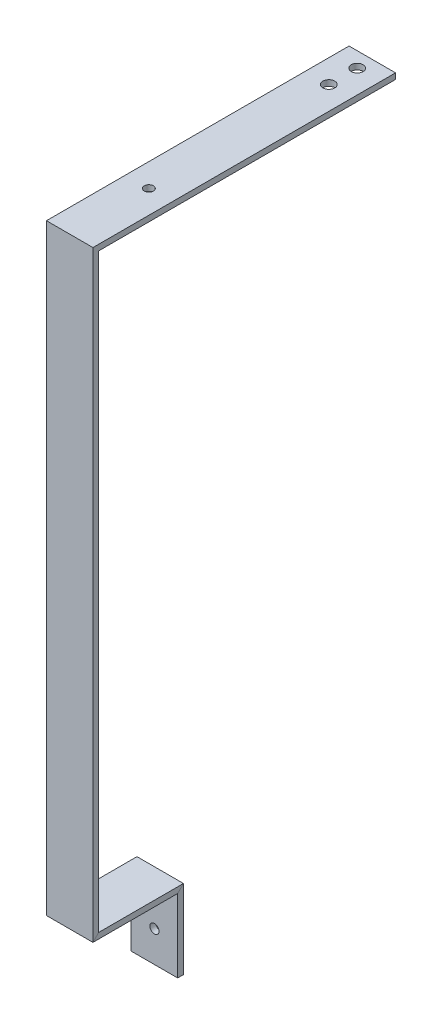
ISO-10303-21;
HEADER;
FILE_DESCRIPTION(('STEP AP214'),'2;1');
FILE_NAME('part.step','',(''),(''),'','','');
FILE_SCHEMA(('AUTOMOTIVE_DESIGN { 1 0 10303 214 1 1 1 1 }'));
ENDSEC;
DATA;
#1=APPLICATION_CONTEXT('core data for automotive mechanical design processes');
#2=APPLICATION_PROTOCOL_DEFINITION('international standard','automotive_design',2000,#1);
#3=PRODUCT_CONTEXT('',#1,'mechanical');
#4=PRODUCT('Part','Part','',(#3));
#5=PRODUCT_RELATED_PRODUCT_CATEGORY('part','',(#4));
#6=PRODUCT_DEFINITION_FORMATION('','',#4);
#7=PRODUCT_DEFINITION_CONTEXT('part definition',#1,'design');
#8=PRODUCT_DEFINITION('design','',#6,#7);
#9=PRODUCT_DEFINITION_SHAPE('','',#8);
#10=(LENGTH_UNIT() NAMED_UNIT(*) SI_UNIT(.MILLI.,.METRE.));
#11=(NAMED_UNIT(*) PLANE_ANGLE_UNIT() SI_UNIT($,.RADIAN.));
#12=(NAMED_UNIT(*) SI_UNIT($,.STERADIAN.) SOLID_ANGLE_UNIT());
#13=UNCERTAINTY_MEASURE_WITH_UNIT(LENGTH_MEASURE(1.E-05),#10,'distance_accuracy_value','');
#14=(GEOMETRIC_REPRESENTATION_CONTEXT(3) GLOBAL_UNCERTAINTY_ASSIGNED_CONTEXT((#13)) GLOBAL_UNIT_ASSIGNED_CONTEXT((#10,
#11,#12)) REPRESENTATION_CONTEXT('',''));
#15=CARTESIAN_POINT('',(0.,0.,0.));
#16=DIRECTION('',(0.,0.,1.));
#17=DIRECTION('',(1.,0.,0.));
#18=AXIS2_PLACEMENT_3D('',#15,#16,#17);
#19=CARTESIAN_POINT('',(-25.4,-3.155,330.7));
#20=DIRECTION('',(0.,1.,0.));
#21=DIRECTION('',(0.,0.,1.));
#22=AXIS2_PLACEMENT_3D('',#19,#20,#21);
#23=PLANE('',#22);
#24=CARTESIAN_POINT('',(0.,-3.155,244.19));
#25=DIRECTION('',(0.,1.,0.));
#26=DIRECTION('',(0.,0.,1.));
#27=AXIS2_PLACEMENT_3D('',#24,#25,#26);
#28=CIRCLE('',#27,5.);
#29=CARTESIAN_POINT('',(0.,-3.155,249.19));
#30=VERTEX_POINT('',#29);
#31=EDGE_CURVE('E433',#30,#30,#28,.T.);
#32=ORIENTED_EDGE('',*,*,#31,.T.);
#33=EDGE_LOOP('',(#32));
#34=FACE_BOUND('',#33,.T.);
#35=CARTESIAN_POINT('',(-8.76417590224891E-12,-3.155,16.4999999999976));
#36=DIRECTION('',(0.,1.,0.));
#37=DIRECTION('',(0.,0.,1.));
#38=AXIS2_PLACEMENT_3D('',#35,#36,#37);
#39=CIRCLE('',#38,6.50000000000052);
#40=CARTESIAN_POINT('',(-8.76417590224891E-12,-3.155,22.9999999999981));
#41=VERTEX_POINT('',#40);
#42=EDGE_CURVE('E283',#41,#41,#39,.T.);
#43=ORIENTED_EDGE('',*,*,#42,.T.);
#44=EDGE_LOOP('',(#43));
#45=FACE_BOUND('',#44,.T.);
#46=CARTESIAN_POINT('',(-8.65421913505661E-12,-3.155,47.4999999999976));
#47=DIRECTION('',(0.,1.,0.));
#48=DIRECTION('',(0.,0.,1.));
#49=AXIS2_PLACEMENT_3D('',#46,#47,#48);
#50=CIRCLE('',#49,6.50000000000052);
#51=CARTESIAN_POINT('',(-8.65421913505661E-12,-3.155,53.9999999999981));
#52=VERTEX_POINT('',#51);
#53=EDGE_CURVE('E282',#52,#52,#50,.T.);
#54=ORIENTED_EDGE('',*,*,#53,.T.);
#55=EDGE_LOOP('',(#54));
#56=FACE_BOUND('',#55,.T.);
#57=DIRECTION('',(1.,0.,0.));
#58=VECTOR('',#57,1.);
#59=CARTESIAN_POINT('',(25.4,-3.155,324.39));
#60=LINE('',#59,#58);
#61=CARTESIAN_POINT('',(-25.4,-3.155,324.39));
#62=VERTEX_POINT('',#61);
#63=CARTESIAN_POINT('',(25.4,-3.155,324.39));
#64=VERTEX_POINT('',#63);
#65=EDGE_CURVE('E50',#62,#64,#60,.T.);
#66=ORIENTED_EDGE('',*,*,#65,.F.);
#67=DIRECTION('',(0.,0.,-1.));
#68=VECTOR('',#67,1.);
#69=CARTESIAN_POINT('',(-25.4,-3.155,330.7));
#70=LINE('',#69,#68);
#71=CARTESIAN_POINT('',(-25.4,-3.155,0.));
#72=VERTEX_POINT('',#71);
#73=EDGE_CURVE('E85',#62,#72,#70,.T.);
#74=ORIENTED_EDGE('',*,*,#73,.T.);
#75=DIRECTION('',(1.,0.,0.));
#76=VECTOR('',#75,1.);
#77=CARTESIAN_POINT('',(-25.4,-3.155,0.));
#78=LINE('',#77,#76);
#79=CARTESIAN_POINT('',(25.4,-3.155,0.));
#80=VERTEX_POINT('',#79);
#81=EDGE_CURVE('E89',#72,#80,#78,.T.);
#82=ORIENTED_EDGE('',*,*,#81,.T.);
#83=DIRECTION('',(0.,0.,-1.));
#84=VECTOR('',#83,1.);
#85=CARTESIAN_POINT('',(25.4,-3.155,330.7));
#86=LINE('',#85,#84);
#87=EDGE_CURVE('E77',#64,#80,#86,.T.);
#88=ORIENTED_EDGE('',*,*,#87,.F.);
#89=EDGE_LOOP('',(#66,#74,#82,#88));
#90=FACE_BOUND('',#89,.T.);
#91=ADVANCED_FACE('F34',(#34,#45,#56,#90),#23,.F.);
#92=CARTESIAN_POINT('',(25.4,3.155,330.7));
#93=DIRECTION('',(-1.,0.,0.));
#94=DIRECTION('',(0.,0.,1.));
#95=AXIS2_PLACEMENT_3D('',#92,#93,#94);
#96=PLANE('',#95);
#97=DIRECTION('',(0.,1.,0.));
#98=VECTOR('',#97,1.);
#99=CARTESIAN_POINT('',(25.4,3.155,0.));
#100=LINE('',#99,#98);
#101=CARTESIAN_POINT('',(25.4,3.155,0.));
#102=VERTEX_POINT('',#101);
#103=EDGE_CURVE('E81',#80,#102,#100,.T.);
#104=ORIENTED_EDGE('',*,*,#103,.T.);
#105=DIRECTION('',(0.,0.,-1.));
#106=VECTOR('',#105,1.);
#107=CARTESIAN_POINT('',(25.4,3.155,330.7));
#108=LINE('',#107,#106);
#109=CARTESIAN_POINT('',(25.4,3.155,330.7));
#110=VERTEX_POINT('',#109);
#111=EDGE_CURVE('E11',#110,#102,#108,.T.);
#112=ORIENTED_EDGE('',*,*,#111,.F.);
#113=DIRECTION('',(0.,1.,0.));
#114=VECTOR('',#113,1.);
#115=CARTESIAN_POINT('',(25.4,3.155,330.7));
#116=LINE('',#115,#114);
#117=CARTESIAN_POINT('',(25.4,-654.51,330.7));
#118=VERTEX_POINT('',#117);
#119=EDGE_CURVE('E93',#118,#110,#116,.T.);
#120=ORIENTED_EDGE('',*,*,#119,.F.);
#121=DIRECTION('',(0.,0.707106781186548,-0.707106781186548));
#122=VECTOR('',#121,1.);
#123=CARTESIAN_POINT('',(25.4,-644.7775,320.9675));
#124=LINE('',#123,#122);
#125=CARTESIAN_POINT('',(25.4,-648.2,324.39));
#126=VERTEX_POINT('',#125);
#127=EDGE_CURVE('E119',#118,#126,#124,.T.);
#128=ORIENTED_EDGE('',*,*,#127,.T.);
#129=DIRECTION('',(0.,1.,0.));
#130=VECTOR('',#129,1.);
#131=CARTESIAN_POINT('',(25.4,-641.355,324.39));
#132=LINE('',#131,#130);
#133=EDGE_CURVE('E84',#126,#64,#132,.T.);
#134=ORIENTED_EDGE('',*,*,#133,.T.);
#135=ORIENTED_EDGE('',*,*,#87,.T.);
#136=EDGE_LOOP('',(#104,#112,#120,#128,#134,#135));
#137=FACE_BOUND('',#136,.T.);
#138=ADVANCED_FACE('F36',(#137),#96,.F.);
#139=CARTESIAN_POINT('',(-25.4,3.155,330.7));
#140=DIRECTION('',(0.,-1.,0.));
#141=DIRECTION('',(0.,0.,-1.));
#142=AXIS2_PLACEMENT_3D('',#139,#140,#141);
#143=PLANE('',#142);
#144=CARTESIAN_POINT('',(0.,3.155,244.19));
#145=DIRECTION('',(0.,1.,0.));
#146=DIRECTION('',(0.,0.,1.));
#147=AXIS2_PLACEMENT_3D('',#144,#145,#146);
#148=CIRCLE('',#147,5.);
#149=CARTESIAN_POINT('',(0.,3.155,249.19));
#150=VERTEX_POINT('',#149);
#151=EDGE_CURVE('E273',#150,#150,#148,.T.);
#152=ORIENTED_EDGE('',*,*,#151,.F.);
#153=EDGE_LOOP('',(#152));
#154=FACE_BOUND('',#153,.T.);
#155=CARTESIAN_POINT('',(-8.76417590224891E-12,3.155,16.4999999999976));
#156=DIRECTION('',(0.,1.,0.));
#157=DIRECTION('',(0.,0.,1.));
#158=AXIS2_PLACEMENT_3D('',#155,#156,#157);
#159=CIRCLE('',#158,6.50000000000052);
#160=CARTESIAN_POINT('',(-8.76417590224891E-12,3.155,22.9999999999981));
#161=VERTEX_POINT('',#160);
#162=EDGE_CURVE('E277',#161,#161,#159,.T.);
#163=ORIENTED_EDGE('',*,*,#162,.F.);
#164=EDGE_LOOP('',(#163));
#165=FACE_BOUND('',#164,.T.);
#166=CARTESIAN_POINT('',(-8.65421913505661E-12,3.155,47.4999999999976));
#167=DIRECTION('',(0.,1.,0.));
#168=DIRECTION('',(0.,0.,1.));
#169=AXIS2_PLACEMENT_3D('',#166,#167,#168);
#170=CIRCLE('',#169,6.50000000000052);
#171=CARTESIAN_POINT('',(-8.65421913505661E-12,3.155,53.9999999999981));
#172=VERTEX_POINT('',#171);
#173=EDGE_CURVE('E280',#172,#172,#170,.T.);
#174=ORIENTED_EDGE('',*,*,#173,.F.);
#175=EDGE_LOOP('',(#174));
#176=FACE_BOUND('',#175,.T.);
#177=DIRECTION('',(-1.,0.,0.));
#178=VECTOR('',#177,1.);
#179=CARTESIAN_POINT('',(-25.4,3.155,0.));
#180=LINE('',#179,#178);
#181=CARTESIAN_POINT('',(-25.4,3.155,0.));
#182=VERTEX_POINT('',#181);
#183=EDGE_CURVE('E97',#102,#182,#180,.T.);
#184=ORIENTED_EDGE('',*,*,#183,.T.);
#185=DIRECTION('',(0.,0.,-1.));
#186=VECTOR('',#185,1.);
#187=CARTESIAN_POINT('',(-25.4,3.155,330.7));
#188=LINE('',#187,#186);
#189=CARTESIAN_POINT('',(-25.4,3.155,330.7));
#190=VERTEX_POINT('',#189);
#191=EDGE_CURVE('E43',#190,#182,#188,.T.);
#192=ORIENTED_EDGE('',*,*,#191,.F.);
#193=DIRECTION('',(-1.,0.,0.));
#194=VECTOR('',#193,1.);
#195=CARTESIAN_POINT('',(-25.4,3.155,330.7));
#196=LINE('',#195,#194);
#197=EDGE_CURVE('E59',#110,#190,#196,.T.);
#198=ORIENTED_EDGE('',*,*,#197,.F.);
#199=ORIENTED_EDGE('',*,*,#111,.T.);
#200=EDGE_LOOP('',(#184,#192,#198,#199));
#201=FACE_BOUND('',#200,.T.);
#202=ADVANCED_FACE('F114',(#154,#165,#176,#201),#143,.F.);
#203=CARTESIAN_POINT('',(-25.4,3.155,330.7));
#204=DIRECTION('',(1.,0.,0.));
#205=DIRECTION('',(0.,0.,-1.));
#206=AXIS2_PLACEMENT_3D('',#203,#204,#205);
#207=PLANE('',#206);
#208=DIRECTION('',(0.,-1.,0.));
#209=VECTOR('',#208,1.);
#210=CARTESIAN_POINT('',(-25.4,3.155,0.));
#211=LINE('',#210,#209);
#212=EDGE_CURVE('E94',#182,#72,#211,.T.);
#213=ORIENTED_EDGE('',*,*,#212,.T.);
#214=ORIENTED_EDGE('',*,*,#73,.F.);
#215=DIRECTION('',(0.,1.,0.));
#216=VECTOR('',#215,1.);
#217=CARTESIAN_POINT('',(-25.4,-641.355,324.39));
#218=LINE('',#217,#216);
#219=CARTESIAN_POINT('',(-25.4,-648.2,324.39));
#220=VERTEX_POINT('',#219);
#221=EDGE_CURVE('E98',#220,#62,#218,.T.);
#222=ORIENTED_EDGE('',*,*,#221,.F.);
#223=DIRECTION('',(0.,-0.707106781186548,0.707106781186548));
#224=VECTOR('',#223,1.);
#225=CARTESIAN_POINT('',(-25.4,-647.9325,324.1225));
#226=LINE('',#225,#224);
#227=CARTESIAN_POINT('',(-25.4,-654.51,330.7));
#228=VERTEX_POINT('',#227);
#229=EDGE_CURVE('E147',#220,#228,#226,.T.);
#230=ORIENTED_EDGE('',*,*,#229,.T.);
#231=DIRECTION('',(0.,-1.,0.));
#232=VECTOR('',#231,1.);
#233=CARTESIAN_POINT('',(-25.4,3.155,330.7));
#234=LINE('',#233,#232);
#235=EDGE_CURVE('E86',#190,#228,#234,.T.);
#236=ORIENTED_EDGE('',*,*,#235,.F.);
#237=ORIENTED_EDGE('',*,*,#191,.T.);
#238=EDGE_LOOP('',(#213,#214,#222,#230,#236,#237));
#239=FACE_BOUND('',#238,.T.);
#240=ADVANCED_FACE('F111',(#239),#207,.F.);
#241=CARTESIAN_POINT('',(0.,0.,330.7));
#242=DIRECTION('',(0.,0.,1.));
#243=DIRECTION('',(1.,0.,0.));
#244=AXIS2_PLACEMENT_3D('',#241,#242,#243);
#245=PLANE('',#244);
#246=ORIENTED_EDGE('',*,*,#119,.T.);
#247=ORIENTED_EDGE('',*,*,#197,.T.);
#248=ORIENTED_EDGE('',*,*,#235,.T.);
#249=DIRECTION('',(1.,0.,0.));
#250=VECTOR('',#249,1.);
#251=CARTESIAN_POINT('',(25.4,-654.51,330.7));
#252=LINE('',#251,#250);
#253=EDGE_CURVE('E134',#228,#118,#252,.T.);
#254=ORIENTED_EDGE('',*,*,#253,.T.);
#255=EDGE_LOOP('',(#246,#247,#248,#254));
#256=FACE_BOUND('',#255,.T.);
#257=ADVANCED_FACE('F146',(#256),#245,.T.);
#258=CARTESIAN_POINT('',(0.,0.,0.));
#259=DIRECTION('',(0.,0.,1.));
#260=DIRECTION('',(1.,0.,0.));
#261=AXIS2_PLACEMENT_3D('',#258,#259,#260);
#262=PLANE('',#261);
#263=ORIENTED_EDGE('',*,*,#103,.F.);
#264=ORIENTED_EDGE('',*,*,#81,.F.);
#265=ORIENTED_EDGE('',*,*,#212,.F.);
#266=ORIENTED_EDGE('',*,*,#183,.F.);
#267=EDGE_LOOP('',(#263,#264,#265,#266));
#268=FACE_BOUND('',#267,.T.);
#269=ADVANCED_FACE('F96',(#268),#262,.F.);
#270=CARTESIAN_POINT('',(25.4,-641.355,324.39));
#271=DIRECTION('',(0.,0.,1.));
#272=DIRECTION('',(1.,0.,0.));
#273=AXIS2_PLACEMENT_3D('',#270,#271,#272);
#274=PLANE('',#273);
#275=ORIENTED_EDGE('',*,*,#65,.T.);
#276=ORIENTED_EDGE('',*,*,#133,.F.);
#277=DIRECTION('',(-1.,0.,0.));
#278=VECTOR('',#277,1.);
#279=CARTESIAN_POINT('',(-25.4,-648.2,324.39));
#280=LINE('',#279,#278);
#281=EDGE_CURVE('E149',#126,#220,#280,.T.);
#282=ORIENTED_EDGE('',*,*,#281,.T.);
#283=ORIENTED_EDGE('',*,*,#221,.T.);
#284=EDGE_LOOP('',(#275,#276,#282,#283));
#285=FACE_BOUND('',#284,.T.);
#286=ADVANCED_FACE('F195',(#285),#274,.F.);
#287=CARTESIAN_POINT('',(0.,-734.515,-92.6100000000001));
#288=DIRECTION('',(0.,-1.,0.));
#289=DIRECTION('',(0.,0.,-1.));
#290=AXIS2_PLACEMENT_3D('',#287,#288,#289);
#291=PLANE('',#290);
#292=DIRECTION('',(1.,0.,0.));
#293=VECTOR('',#292,1.);
#294=CARTESIAN_POINT('',(-25.4,-734.515,231.78));
#295=LINE('',#294,#293);
#296=CARTESIAN_POINT('',(-25.4,-734.515,231.78));
#297=VERTEX_POINT('',#296);
#298=CARTESIAN_POINT('',(25.4,-734.515,231.78));
#299=VERTEX_POINT('',#298);
#300=EDGE_CURVE('E179',#297,#299,#295,.T.);
#301=ORIENTED_EDGE('',*,*,#300,.T.);
#302=DIRECTION('',(0.,0.,1.));
#303=VECTOR('',#302,1.);
#304=CARTESIAN_POINT('',(25.4,-734.515,231.78));
#305=LINE('',#304,#303);
#306=CARTESIAN_POINT('',(25.4,-734.515,238.09));
#307=VERTEX_POINT('',#306);
#308=EDGE_CURVE('E176',#299,#307,#305,.T.);
#309=ORIENTED_EDGE('',*,*,#308,.T.);
#310=DIRECTION('',(-1.,0.,0.));
#311=VECTOR('',#310,1.);
#312=CARTESIAN_POINT('',(25.4,-734.515,238.09));
#313=LINE('',#312,#311);
#314=CARTESIAN_POINT('',(-25.4,-734.515,238.09));
#315=VERTEX_POINT('',#314);
#316=EDGE_CURVE('E173',#307,#315,#313,.T.);
#317=ORIENTED_EDGE('',*,*,#316,.T.);
#318=DIRECTION('',(0.,0.,-1.));
#319=VECTOR('',#318,1.);
#320=CARTESIAN_POINT('',(-25.4,-734.515,238.09));
#321=LINE('',#320,#319);
#322=EDGE_CURVE('E170',#315,#297,#321,.T.);
#323=ORIENTED_EDGE('',*,*,#322,.T.);
#324=EDGE_LOOP('',(#301,#309,#317,#323));
#325=FACE_BOUND('',#324,.T.);
#326=ADVANCED_FACE('F237',(#325),#291,.T.);
#327=CARTESIAN_POINT('',(-25.4,-647.7845,231.78));
#328=DIRECTION('',(0.,0.,-1.));
#329=DIRECTION('',(-1.,0.,0.));
#330=AXIS2_PLACEMENT_3D('',#327,#328,#329);
#331=PLANE('',#330);
#332=CARTESIAN_POINT('',(0.,-700.505,231.78));
#333=DIRECTION('',(0.,0.,-1.));
#334=DIRECTION('',(-1.,0.,0.));
#335=AXIS2_PLACEMENT_3D('',#332,#333,#334);
#336=CIRCLE('',#335,5.00000000000001);
#337=CARTESIAN_POINT('',(-5.00000000000001,-700.505,231.78));
#338=VERTEX_POINT('',#337);
#339=EDGE_CURVE('E286',#338,#338,#336,.T.);
#340=ORIENTED_EDGE('',*,*,#339,.F.);
#341=EDGE_LOOP('',(#340));
#342=FACE_BOUND('',#341,.T.);
#343=DIRECTION('',(-1.,0.,0.));
#344=VECTOR('',#343,1.);
#345=CARTESIAN_POINT('',(-25.4,-648.2,231.78));
#346=LINE('',#345,#344);
#347=CARTESIAN_POINT('',(25.4,-648.2,231.78));
#348=VERTEX_POINT('',#347);
#349=CARTESIAN_POINT('',(-25.4,-648.2,231.78));
#350=VERTEX_POINT('',#349);
#351=EDGE_CURVE('E161',#348,#350,#346,.T.);
#352=ORIENTED_EDGE('',*,*,#351,.F.);
#353=DIRECTION('',(0.,-1.,0.));
#354=VECTOR('',#353,1.);
#355=CARTESIAN_POINT('',(25.4,-647.7845,231.78));
#356=LINE('',#355,#354);
#357=EDGE_CURVE('E188',#348,#299,#356,.T.);
#358=ORIENTED_EDGE('',*,*,#357,.T.);
#359=ORIENTED_EDGE('',*,*,#300,.F.);
#360=DIRECTION('',(0.,-1.,0.));
#361=VECTOR('',#360,1.);
#362=CARTESIAN_POINT('',(-25.4,-647.7845,231.78));
#363=LINE('',#362,#361);
#364=EDGE_CURVE('E162',#350,#297,#363,.T.);
#365=ORIENTED_EDGE('',*,*,#364,.F.);
#366=EDGE_LOOP('',(#352,#358,#359,#365));
#367=FACE_BOUND('',#366,.T.);
#368=ADVANCED_FACE('F229',(#342,#367),#331,.T.);
#369=CARTESIAN_POINT('',(25.4,-647.7845,231.78));
#370=DIRECTION('',(1.,0.,0.));
#371=DIRECTION('',(0.,0.,-1.));
#372=AXIS2_PLACEMENT_3D('',#369,#370,#371);
#373=PLANE('',#372);
#374=DIRECTION('',(0.,0.707106781186548,-0.707106781186548));
#375=VECTOR('',#374,1.);
#376=CARTESIAN_POINT('',(25.4,-697.86775,281.44775));
#377=LINE('',#376,#375);
#378=CARTESIAN_POINT('',(25.4,-654.51,238.09));
#379=VERTEX_POINT('',#378);
#380=EDGE_CURVE('E155',#379,#348,#377,.T.);
#381=ORIENTED_EDGE('',*,*,#380,.F.);
#382=DIRECTION('',(0.,-1.,0.));
#383=VECTOR('',#382,1.);
#384=CARTESIAN_POINT('',(25.4,-647.7845,238.09));
#385=LINE('',#384,#383);
#386=EDGE_CURVE('E185',#379,#307,#385,.T.);
#387=ORIENTED_EDGE('',*,*,#386,.T.);
#388=ORIENTED_EDGE('',*,*,#308,.F.);
#389=ORIENTED_EDGE('',*,*,#357,.F.);
#390=EDGE_LOOP('',(#381,#387,#388,#389));
#391=FACE_BOUND('',#390,.T.);
#392=ADVANCED_FACE('F233',(#391),#373,.T.);
#393=CARTESIAN_POINT('',(25.4,-647.7845,238.09));
#394=DIRECTION('',(0.,0.,1.));
#395=DIRECTION('',(1.,0.,0.));
#396=AXIS2_PLACEMENT_3D('',#393,#394,#395);
#397=PLANE('',#396);
#398=CARTESIAN_POINT('',(0.,-700.505,238.09));
#399=DIRECTION('',(0.,0.,1.));
#400=DIRECTION('',(1.,0.,0.));
#401=AXIS2_PLACEMENT_3D('',#398,#399,#400);
#402=CIRCLE('',#401,5.00000000000001);
#403=CARTESIAN_POINT('',(5.00000000000001,-700.505,238.09));
#404=VERTEX_POINT('',#403);
#405=EDGE_CURVE('E38',#404,#404,#402,.T.);
#406=ORIENTED_EDGE('',*,*,#405,.F.);
#407=EDGE_LOOP('',(#406));
#408=FACE_BOUND('',#407,.T.);
#409=DIRECTION('',(1.,0.,0.));
#410=VECTOR('',#409,1.);
#411=CARTESIAN_POINT('',(25.4,-654.51,238.09));
#412=LINE('',#411,#410);
#413=CARTESIAN_POINT('',(-25.4,-654.51,238.09));
#414=VERTEX_POINT('',#413);
#415=EDGE_CURVE('E143',#414,#379,#412,.T.);
#416=ORIENTED_EDGE('',*,*,#415,.F.);
#417=DIRECTION('',(0.,-1.,0.));
#418=VECTOR('',#417,1.);
#419=CARTESIAN_POINT('',(-25.4,-647.7845,238.09));
#420=LINE('',#419,#418);
#421=EDGE_CURVE('E182',#414,#315,#420,.T.);
#422=ORIENTED_EDGE('',*,*,#421,.T.);
#423=ORIENTED_EDGE('',*,*,#316,.F.);
#424=ORIENTED_EDGE('',*,*,#386,.F.);
#425=EDGE_LOOP('',(#416,#422,#423,#424));
#426=FACE_BOUND('',#425,.T.);
#427=ADVANCED_FACE('F240',(#408,#426),#397,.T.);
#428=CARTESIAN_POINT('',(-25.4,-647.7845,238.09));
#429=DIRECTION('',(-1.,0.,0.));
#430=DIRECTION('',(0.,0.,1.));
#431=AXIS2_PLACEMENT_3D('',#428,#429,#430);
#432=PLANE('',#431);
#433=DIRECTION('',(0.,-0.707106781186548,0.707106781186548));
#434=VECTOR('',#433,1.);
#435=CARTESIAN_POINT('',(-25.4,-701.02275,284.60275));
#436=LINE('',#435,#434);
#437=EDGE_CURVE('E158',#350,#414,#436,.T.);
#438=ORIENTED_EDGE('',*,*,#437,.F.);
#439=ORIENTED_EDGE('',*,*,#364,.T.);
#440=ORIENTED_EDGE('',*,*,#322,.F.);
#441=ORIENTED_EDGE('',*,*,#421,.F.);
#442=EDGE_LOOP('',(#438,#439,#440,#441));
#443=FACE_BOUND('',#442,.T.);
#444=ADVANCED_FACE('F243',(#443),#432,.T.);
#445=CARTESIAN_POINT('',(-25.4,-654.51,331.1155));
#446=DIRECTION('',(-1.,0.,0.));
#447=DIRECTION('',(0.,0.,1.));
#448=AXIS2_PLACEMENT_3D('',#445,#446,#447);
#449=PLANE('',#448);
#450=DIRECTION('',(0.,0.,-1.));
#451=VECTOR('',#450,1.);
#452=CARTESIAN_POINT('',(-25.4,-648.2,331.1155));
#453=LINE('',#452,#451);
#454=EDGE_CURVE('E165',#220,#350,#453,.T.);
#455=ORIENTED_EDGE('',*,*,#454,.T.);
#456=ORIENTED_EDGE('',*,*,#437,.T.);
#457=DIRECTION('',(0.,0.,-1.));
#458=VECTOR('',#457,1.);
#459=CARTESIAN_POINT('',(-25.4,-654.51,331.1155));
#460=LINE('',#459,#458);
#461=EDGE_CURVE('E144',#228,#414,#460,.T.);
#462=ORIENTED_EDGE('',*,*,#461,.F.);
#463=ORIENTED_EDGE('',*,*,#229,.F.);
#464=EDGE_LOOP('',(#455,#456,#462,#463));
#465=FACE_BOUND('',#464,.T.);
#466=ADVANCED_FACE('F223',(#465),#449,.T.);
#467=CARTESIAN_POINT('',(25.4,-654.51,331.1155));
#468=DIRECTION('',(0.,-1.,0.));
#469=DIRECTION('',(0.,0.,-1.));
#470=AXIS2_PLACEMENT_3D('',#467,#468,#469);
#471=PLANE('',#470);
#472=ORIENTED_EDGE('',*,*,#461,.T.);
#473=ORIENTED_EDGE('',*,*,#415,.T.);
#474=DIRECTION('',(0.,0.,-1.));
#475=VECTOR('',#474,1.);
#476=CARTESIAN_POINT('',(25.4,-654.51,331.1155));
#477=LINE('',#476,#475);
#478=EDGE_CURVE('E131',#118,#379,#477,.T.);
#479=ORIENTED_EDGE('',*,*,#478,.F.);
#480=ORIENTED_EDGE('',*,*,#253,.F.);
#481=EDGE_LOOP('',(#472,#473,#479,#480));
#482=FACE_BOUND('',#481,.T.);
#483=ADVANCED_FACE('F140',(#482),#471,.T.);
#484=CARTESIAN_POINT('',(25.4,-648.2,331.1155));
#485=DIRECTION('',(1.,0.,0.));
#486=DIRECTION('',(0.,0.,-1.));
#487=AXIS2_PLACEMENT_3D('',#484,#485,#486);
#488=PLANE('',#487);
#489=ORIENTED_EDGE('',*,*,#478,.T.);
#490=ORIENTED_EDGE('',*,*,#380,.T.);
#491=DIRECTION('',(0.,0.,-1.));
#492=VECTOR('',#491,1.);
#493=CARTESIAN_POINT('',(25.4,-648.2,331.1155));
#494=LINE('',#493,#492);
#495=EDGE_CURVE('E133',#126,#348,#494,.T.);
#496=ORIENTED_EDGE('',*,*,#495,.F.);
#497=ORIENTED_EDGE('',*,*,#127,.F.);
#498=EDGE_LOOP('',(#489,#490,#496,#497));
#499=FACE_BOUND('',#498,.T.);
#500=ADVANCED_FACE('F128',(#499),#488,.T.);
#501=CARTESIAN_POINT('',(-25.4,-648.2,331.1155));
#502=DIRECTION('',(0.,1.,0.));
#503=DIRECTION('',(0.,0.,1.));
#504=AXIS2_PLACEMENT_3D('',#501,#502,#503);
#505=PLANE('',#504);
#506=ORIENTED_EDGE('',*,*,#495,.T.);
#507=ORIENTED_EDGE('',*,*,#351,.T.);
#508=ORIENTED_EDGE('',*,*,#454,.F.);
#509=ORIENTED_EDGE('',*,*,#281,.F.);
#510=EDGE_LOOP('',(#506,#507,#508,#509));
#511=FACE_BOUND('',#510,.T.);
#512=ADVANCED_FACE('F225',(#511),#505,.T.);
#513=CARTESIAN_POINT('',(0.,-700.505,247.655));
#514=DIRECTION('',(0.,0.,-1.));
#515=DIRECTION('',(-1.,0.,0.));
#516=AXIS2_PLACEMENT_3D('',#513,#514,#515);
#517=CYLINDRICAL_SURFACE('',#516,5.00000000000001);
#518=ORIENTED_EDGE('',*,*,#405,.T.);
#519=EDGE_LOOP('',(#518));
#520=FACE_BOUND('',#519,.T.);
#521=ORIENTED_EDGE('',*,*,#339,.T.);
#522=EDGE_LOOP('',(#521));
#523=FACE_BOUND('',#522,.T.);
#524=ADVANCED_FACE('F297',(#520,#523),#517,.F.);
#525=CARTESIAN_POINT('',(-8.65421913505661E-12,-12.72,47.4999999999976));
#526=DIRECTION('',(0.,1.,0.));
#527=DIRECTION('',(0.,0.,1.));
#528=AXIS2_PLACEMENT_3D('',#525,#526,#527);
#529=CYLINDRICAL_SURFACE('',#528,6.50000000000052);
#530=ORIENTED_EDGE('',*,*,#173,.T.);
#531=EDGE_LOOP('',(#530));
#532=FACE_BOUND('',#531,.T.);
#533=ORIENTED_EDGE('',*,*,#53,.F.);
#534=EDGE_LOOP('',(#533));
#535=FACE_BOUND('',#534,.T.);
#536=ADVANCED_FACE('F299',(#532,#535),#529,.F.);
#537=CARTESIAN_POINT('',(-8.76417590224891E-12,-12.72,16.4999999999976));
#538=DIRECTION('',(0.,1.,0.));
#539=DIRECTION('',(0.,0.,1.));
#540=AXIS2_PLACEMENT_3D('',#537,#538,#539);
#541=CYLINDRICAL_SURFACE('',#540,6.50000000000052);
#542=ORIENTED_EDGE('',*,*,#162,.T.);
#543=EDGE_LOOP('',(#542));
#544=FACE_BOUND('',#543,.T.);
#545=ORIENTED_EDGE('',*,*,#42,.F.);
#546=EDGE_LOOP('',(#545));
#547=FACE_BOUND('',#546,.T.);
#548=ADVANCED_FACE('F305',(#544,#547),#541,.F.);
#549=CARTESIAN_POINT('',(0.,-6.845,244.19));
#550=DIRECTION('',(0.,1.,0.));
#551=DIRECTION('',(0.,0.,1.));
#552=AXIS2_PLACEMENT_3D('',#549,#550,#551);
#553=CYLINDRICAL_SURFACE('',#552,5.);
#554=ORIENTED_EDGE('',*,*,#151,.T.);
#555=EDGE_LOOP('',(#554));
#556=FACE_BOUND('',#555,.T.);
#557=ORIENTED_EDGE('',*,*,#31,.F.);
#558=EDGE_LOOP('',(#557));
#559=FACE_BOUND('',#558,.T.);
#560=ADVANCED_FACE('F405',(#556,#559),#553,.F.);
#561=CLOSED_SHELL('',(#91,#138,#202,#240,#257,#269,#286,#326,#368,#392,#427,#444,#466,#483,#500,
#512,#524,#536,#548,#560));
#562=MANIFOLD_SOLID_BREP('B2',#561);
#563=ADVANCED_BREP_SHAPE_REPRESENTATION('',(#18,#562),#14);
#564=SHAPE_DEFINITION_REPRESENTATION(#9,#563);
ENDSEC;
END-ISO-10303-21;
